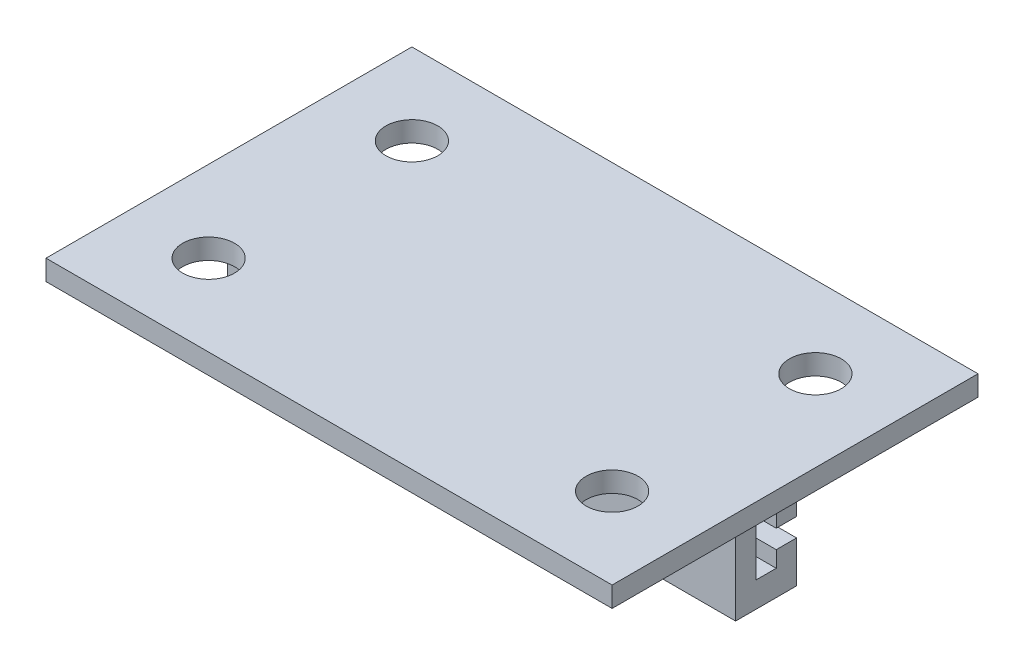
ISO-10303-21;
HEADER;
FILE_DESCRIPTION(('STEP AP214'),'2;1');
FILE_NAME('part.step','',(''),(''),'','','');
FILE_SCHEMA(('AUTOMOTIVE_DESIGN { 1 0 10303 214 1 1 1 1 }'));
ENDSEC;
DATA;
#1=APPLICATION_CONTEXT('core data for automotive mechanical design processes');
#2=APPLICATION_PROTOCOL_DEFINITION('international standard','automotive_design',2000,#1);
#3=PRODUCT_CONTEXT('',#1,'mechanical');
#4=PRODUCT('Part','Part','',(#3));
#5=PRODUCT_RELATED_PRODUCT_CATEGORY('part','',(#4));
#6=PRODUCT_DEFINITION_FORMATION('','',#4);
#7=PRODUCT_DEFINITION_CONTEXT('part definition',#1,'design');
#8=PRODUCT_DEFINITION('design','',#6,#7);
#9=PRODUCT_DEFINITION_SHAPE('','',#8);
#10=(LENGTH_UNIT() NAMED_UNIT(*) SI_UNIT(.MILLI.,.METRE.));
#11=(NAMED_UNIT(*) PLANE_ANGLE_UNIT() SI_UNIT($,.RADIAN.));
#12=(NAMED_UNIT(*) SI_UNIT($,.STERADIAN.) SOLID_ANGLE_UNIT());
#13=UNCERTAINTY_MEASURE_WITH_UNIT(LENGTH_MEASURE(1.E-05),#10,'distance_accuracy_value','');
#14=(GEOMETRIC_REPRESENTATION_CONTEXT(3) GLOBAL_UNCERTAINTY_ASSIGNED_CONTEXT((#13)) GLOBAL_UNIT_ASSIGNED_CONTEXT((#10,
#11,#12)) REPRESENTATION_CONTEXT('',''));
#15=CARTESIAN_POINT('',(0.,0.,0.));
#16=DIRECTION('',(0.,0.,1.));
#17=DIRECTION('',(1.,0.,0.));
#18=AXIS2_PLACEMENT_3D('',#15,#16,#17);
#19=CARTESIAN_POINT('',(50.,0.,-6.));
#20=DIRECTION('',(0.,0.,-1.));
#21=DIRECTION('',(0.,1.,0.));
#22=AXIS2_PLACEMENT_3D('',#19,#20,#21);
#23=PLANE('',#22);
#24=DIRECTION('',(0.,-1.,0.));
#25=VECTOR('',#24,1.);
#26=CARTESIAN_POINT('',(0.,0.,-6.));
#27=LINE('',#26,#25);
#28=CARTESIAN_POINT('',(0.,4.0875,-6.));
#29=VERTEX_POINT('',#28);
#30=CARTESIAN_POINT('',(0.,0.,-6.));
#31=VERTEX_POINT('',#30);
#32=EDGE_CURVE('E190',#29,#31,#27,.T.);
#33=ORIENTED_EDGE('',*,*,#32,.F.);
#34=DIRECTION('',(-1.,0.,0.));
#35=VECTOR('',#34,1.);
#36=CARTESIAN_POINT('',(50.,4.0875,-6.));
#37=LINE('',#36,#35);
#38=CARTESIAN_POINT('',(50.,4.0875,-6.));
#39=VERTEX_POINT('',#38);
#40=EDGE_CURVE('E11',#39,#29,#37,.T.);
#41=ORIENTED_EDGE('',*,*,#40,.F.);
#42=DIRECTION('',(0.,-1.,0.));
#43=VECTOR('',#42,1.);
#44=CARTESIAN_POINT('',(50.,0.,-6.));
#45=LINE('',#44,#43);
#46=CARTESIAN_POINT('',(50.,0.,-6.));
#47=VERTEX_POINT('',#46);
#48=EDGE_CURVE('E214',#39,#47,#45,.T.);
#49=ORIENTED_EDGE('',*,*,#48,.T.);
#50=DIRECTION('',(-1.,0.,0.));
#51=VECTOR('',#50,1.);
#52=CARTESIAN_POINT('',(50.,0.,-6.));
#53=LINE('',#52,#51);
#54=EDGE_CURVE('E99',#47,#31,#53,.T.);
#55=ORIENTED_EDGE('',*,*,#54,.T.);
#56=EDGE_LOOP('',(#33,#41,#49,#55));
#57=FACE_BOUND('',#56,.T.);
#58=ADVANCED_FACE('F39',(#57),#23,.T.);
#59=CARTESIAN_POINT('',(50.,4.0875,0.));
#60=DIRECTION('',(0.,1.,0.));
#61=DIRECTION('',(0.,0.,1.));
#62=AXIS2_PLACEMENT_3D('',#59,#60,#61);
#63=PLANE('',#62);
#64=DIRECTION('',(0.,0.,-1.));
#65=VECTOR('',#64,1.);
#66=CARTESIAN_POINT('',(0.,4.0875,0.));
#67=LINE('',#66,#65);
#68=CARTESIAN_POINT('',(0.,4.0875,-4.));
#69=VERTEX_POINT('',#68);
#70=EDGE_CURVE('E186',#69,#29,#67,.T.);
#71=ORIENTED_EDGE('',*,*,#70,.F.);
#72=DIRECTION('',(-1.,0.,0.));
#73=VECTOR('',#72,1.);
#74=CARTESIAN_POINT('',(50.,4.0875,-4.));
#75=LINE('',#74,#73);
#76=CARTESIAN_POINT('',(50.,4.0875,-4.));
#77=VERTEX_POINT('',#76);
#78=EDGE_CURVE('E47',#77,#69,#75,.T.);
#79=ORIENTED_EDGE('',*,*,#78,.F.);
#80=DIRECTION('',(0.,0.,-1.));
#81=VECTOR('',#80,1.);
#82=CARTESIAN_POINT('',(50.,4.0875,0.));
#83=LINE('',#82,#81);
#84=EDGE_CURVE('E233',#77,#39,#83,.T.);
#85=ORIENTED_EDGE('',*,*,#84,.T.);
#86=ORIENTED_EDGE('',*,*,#40,.T.);
#87=EDGE_LOOP('',(#71,#79,#85,#86));
#88=FACE_BOUND('',#87,.T.);
#89=ADVANCED_FACE('F187',(#88),#63,.T.);
#90=CARTESIAN_POINT('',(50.,0.,-4.));
#91=DIRECTION('',(0.,0.,1.));
#92=DIRECTION('',(1.,0.,0.));
#93=AXIS2_PLACEMENT_3D('',#90,#91,#92);
#94=PLANE('',#93);
#95=DIRECTION('',(0.,1.,0.));
#96=VECTOR('',#95,1.);
#97=CARTESIAN_POINT('',(0.,0.,-4.));
#98=LINE('',#97,#96);
#99=CARTESIAN_POINT('',(0.,2.5,-4.));
#100=VERTEX_POINT('',#99);
#101=EDGE_CURVE('E179',#100,#69,#98,.T.);
#102=ORIENTED_EDGE('',*,*,#101,.F.);
#103=DIRECTION('',(-1.,0.,0.));
#104=VECTOR('',#103,1.);
#105=CARTESIAN_POINT('',(50.,2.5,-4.));
#106=LINE('',#105,#104);
#107=CARTESIAN_POINT('',(50.,2.5,-4.));
#108=VERTEX_POINT('',#107);
#109=EDGE_CURVE('E172',#108,#100,#106,.T.);
#110=ORIENTED_EDGE('',*,*,#109,.F.);
#111=DIRECTION('',(0.,1.,0.));
#112=VECTOR('',#111,1.);
#113=CARTESIAN_POINT('',(50.,0.,-4.));
#114=LINE('',#113,#112);
#115=EDGE_CURVE('E181',#108,#77,#114,.T.);
#116=ORIENTED_EDGE('',*,*,#115,.T.);
#117=ORIENTED_EDGE('',*,*,#78,.T.);
#118=EDGE_LOOP('',(#102,#110,#116,#117));
#119=FACE_BOUND('',#118,.T.);
#120=ADVANCED_FACE('F177',(#119),#94,.T.);
#121=CARTESIAN_POINT('',(50.,2.5,0.));
#122=DIRECTION('',(0.,-1.,0.));
#123=DIRECTION('',(0.,0.,-1.));
#124=AXIS2_PLACEMENT_3D('',#121,#122,#123);
#125=PLANE('',#124);
#126=DIRECTION('',(0.,0.,1.));
#127=VECTOR('',#126,1.);
#128=CARTESIAN_POINT('',(0.,2.5,0.));
#129=LINE('',#128,#127);
#130=CARTESIAN_POINT('',(0.,2.5,-2.));
#131=VERTEX_POINT('',#130);
#132=EDGE_CURVE('E195',#100,#131,#129,.T.);
#133=ORIENTED_EDGE('',*,*,#132,.T.);
#134=DIRECTION('',(-1.,0.,0.));
#135=VECTOR('',#134,1.);
#136=CARTESIAN_POINT('',(50.,2.5,-2.));
#137=LINE('',#136,#135);
#138=CARTESIAN_POINT('',(50.,2.5,-2.));
#139=VERTEX_POINT('',#138);
#140=EDGE_CURVE('E169',#139,#131,#137,.T.);
#141=ORIENTED_EDGE('',*,*,#140,.F.);
#142=DIRECTION('',(0.,0.,1.));
#143=VECTOR('',#142,1.);
#144=CARTESIAN_POINT('',(50.,2.5,0.));
#145=LINE('',#144,#143);
#146=EDGE_CURVE('E236',#108,#139,#145,.T.);
#147=ORIENTED_EDGE('',*,*,#146,.F.);
#148=ORIENTED_EDGE('',*,*,#109,.T.);
#149=EDGE_LOOP('',(#133,#141,#147,#148));
#150=FACE_BOUND('',#149,.T.);
#151=ADVANCED_FACE('F364',(#150),#125,.F.);
#152=CARTESIAN_POINT('',(50.,0.,-2.));
#153=DIRECTION('',(0.,0.,1.));
#154=DIRECTION('',(1.,0.,0.));
#155=AXIS2_PLACEMENT_3D('',#152,#153,#154);
#156=PLANE('',#155);
#157=DIRECTION('',(0.,1.,0.));
#158=VECTOR('',#157,1.);
#159=CARTESIAN_POINT('',(0.,0.,-2.));
#160=LINE('',#159,#158);
#161=CARTESIAN_POINT('',(0.,7.5,-2.));
#162=VERTEX_POINT('',#161);
#163=EDGE_CURVE('E197',#131,#162,#160,.T.);
#164=ORIENTED_EDGE('',*,*,#163,.T.);
#165=DIRECTION('',(-1.,0.,0.));
#166=VECTOR('',#165,1.);
#167=CARTESIAN_POINT('',(50.,7.5,-2.));
#168=LINE('',#167,#166);
#169=CARTESIAN_POINT('',(50.,7.5,-2.));
#170=VERTEX_POINT('',#169);
#171=EDGE_CURVE('E166',#170,#162,#168,.T.);
#172=ORIENTED_EDGE('',*,*,#171,.F.);
#173=DIRECTION('',(0.,1.,0.));
#174=VECTOR('',#173,1.);
#175=CARTESIAN_POINT('',(50.,0.,-2.));
#176=LINE('',#175,#174);
#177=EDGE_CURVE('E238',#139,#170,#176,.T.);
#178=ORIENTED_EDGE('',*,*,#177,.F.);
#179=ORIENTED_EDGE('',*,*,#140,.T.);
#180=EDGE_LOOP('',(#164,#172,#178,#179));
#181=FACE_BOUND('',#180,.T.);
#182=ADVANCED_FACE('F369',(#181),#156,.F.);
#183=CARTESIAN_POINT('',(50.,7.5,0.));
#184=DIRECTION('',(0.,1.,0.));
#185=DIRECTION('',(0.,0.,1.));
#186=AXIS2_PLACEMENT_3D('',#183,#184,#185);
#187=PLANE('',#186);
#188=DIRECTION('',(0.,0.,-1.));
#189=VECTOR('',#188,1.);
#190=CARTESIAN_POINT('',(0.,7.5,0.));
#191=LINE('',#190,#189);
#192=CARTESIAN_POINT('',(0.,7.5,-4.));
#193=VERTEX_POINT('',#192);
#194=EDGE_CURVE('E202',#162,#193,#191,.T.);
#195=ORIENTED_EDGE('',*,*,#194,.T.);
#196=DIRECTION('',(-1.,0.,0.));
#197=VECTOR('',#196,1.);
#198=CARTESIAN_POINT('',(50.,7.5,-4.));
#199=LINE('',#198,#197);
#200=CARTESIAN_POINT('',(50.,7.5,-4.));
#201=VERTEX_POINT('',#200);
#202=EDGE_CURVE('E163',#201,#193,#199,.T.);
#203=ORIENTED_EDGE('',*,*,#202,.F.);
#204=DIRECTION('',(0.,0.,-1.));
#205=VECTOR('',#204,1.);
#206=CARTESIAN_POINT('',(50.,7.5,0.));
#207=LINE('',#206,#205);
#208=EDGE_CURVE('E240',#170,#201,#207,.T.);
#209=ORIENTED_EDGE('',*,*,#208,.F.);
#210=ORIENTED_EDGE('',*,*,#171,.T.);
#211=EDGE_LOOP('',(#195,#203,#209,#210));
#212=FACE_BOUND('',#211,.T.);
#213=ADVANCED_FACE('F373',(#212),#187,.F.);
#214=CARTESIAN_POINT('',(50.,0.,-4.));
#215=DIRECTION('',(0.,0.,-1.));
#216=DIRECTION('',(-1.,0.,0.));
#217=AXIS2_PLACEMENT_3D('',#214,#215,#216);
#218=PLANE('',#217);
#219=DIRECTION('',(0.,-1.,0.));
#220=VECTOR('',#219,1.);
#221=CARTESIAN_POINT('',(0.,0.,-4.));
#222=LINE('',#221,#220);
#223=CARTESIAN_POINT('',(0.,5.9125,-4.));
#224=VERTEX_POINT('',#223);
#225=EDGE_CURVE('E204',#193,#224,#222,.T.);
#226=ORIENTED_EDGE('',*,*,#225,.T.);
#227=DIRECTION('',(-1.,0.,0.));
#228=VECTOR('',#227,1.);
#229=CARTESIAN_POINT('',(50.,5.9125,-4.));
#230=LINE('',#229,#228);
#231=CARTESIAN_POINT('',(50.,5.9125,-4.));
#232=VERTEX_POINT('',#231);
#233=EDGE_CURVE('E160',#232,#224,#230,.T.);
#234=ORIENTED_EDGE('',*,*,#233,.F.);
#235=DIRECTION('',(0.,-1.,0.));
#236=VECTOR('',#235,1.);
#237=CARTESIAN_POINT('',(50.,0.,-4.));
#238=LINE('',#237,#236);
#239=EDGE_CURVE('E242',#201,#232,#238,.T.);
#240=ORIENTED_EDGE('',*,*,#239,.F.);
#241=ORIENTED_EDGE('',*,*,#202,.T.);
#242=EDGE_LOOP('',(#226,#234,#240,#241));
#243=FACE_BOUND('',#242,.T.);
#244=ADVANCED_FACE('F377',(#243),#218,.F.);
#245=CARTESIAN_POINT('',(50.,5.9125,0.));
#246=DIRECTION('',(0.,1.,0.));
#247=DIRECTION('',(0.,0.,1.));
#248=AXIS2_PLACEMENT_3D('',#245,#246,#247);
#249=PLANE('',#248);
#250=DIRECTION('',(0.,0.,-1.));
#251=VECTOR('',#250,1.);
#252=CARTESIAN_POINT('',(0.,5.9125,0.));
#253=LINE('',#252,#251);
#254=CARTESIAN_POINT('',(0.,5.9125,-6.));
#255=VERTEX_POINT('',#254);
#256=EDGE_CURVE('E206',#224,#255,#253,.T.);
#257=ORIENTED_EDGE('',*,*,#256,.T.);
#258=DIRECTION('',(-1.,0.,0.));
#259=VECTOR('',#258,1.);
#260=CARTESIAN_POINT('',(50.,5.9125,-6.));
#261=LINE('',#260,#259);
#262=CARTESIAN_POINT('',(50.,5.9125,-6.));
#263=VERTEX_POINT('',#262);
#264=EDGE_CURVE('E153',#263,#255,#261,.T.);
#265=ORIENTED_EDGE('',*,*,#264,.F.);
#266=DIRECTION('',(0.,0.,-1.));
#267=VECTOR('',#266,1.);
#268=CARTESIAN_POINT('',(50.,5.9125,0.));
#269=LINE('',#268,#267);
#270=EDGE_CURVE('E244',#232,#263,#269,.T.);
#271=ORIENTED_EDGE('',*,*,#270,.F.);
#272=ORIENTED_EDGE('',*,*,#233,.T.);
#273=EDGE_LOOP('',(#257,#265,#271,#272));
#274=FACE_BOUND('',#273,.T.);
#275=ADVANCED_FACE('F251',(#274),#249,.F.);
#276=CARTESIAN_POINT('',(50.,0.,-6.));
#277=DIRECTION('',(0.,0.,1.));
#278=DIRECTION('',(1.,0.,0.));
#279=AXIS2_PLACEMENT_3D('',#276,#277,#278);
#280=PLANE('',#279);
#281=DIRECTION('',(0.,1.,0.));
#282=VECTOR('',#281,1.);
#283=CARTESIAN_POINT('',(0.,0.,-6.));
#284=LINE('',#283,#282);
#285=CARTESIAN_POINT('',(0.,10.,-6.));
#286=VERTEX_POINT('',#285);
#287=EDGE_CURVE('E208',#255,#286,#284,.T.);
#288=ORIENTED_EDGE('',*,*,#287,.T.);
#289=DIRECTION('',(-1.,0.,0.));
#290=VECTOR('',#289,1.);
#291=CARTESIAN_POINT('',(50.,10.,-6.));
#292=LINE('',#291,#290);
#293=CARTESIAN_POINT('',(50.,10.,-6.));
#294=VERTEX_POINT('',#293);
#295=EDGE_CURVE('E151',#294,#286,#292,.T.);
#296=ORIENTED_EDGE('',*,*,#295,.F.);
#297=DIRECTION('',(0.,1.,0.));
#298=VECTOR('',#297,1.);
#299=CARTESIAN_POINT('',(50.,0.,-6.));
#300=LINE('',#299,#298);
#301=EDGE_CURVE('E136',#263,#294,#300,.T.);
#302=ORIENTED_EDGE('',*,*,#301,.F.);
#303=ORIENTED_EDGE('',*,*,#264,.T.);
#304=EDGE_LOOP('',(#288,#296,#302,#303));
#305=FACE_BOUND('',#304,.T.);
#306=ADVANCED_FACE('F255',(#305),#280,.F.);
#307=CARTESIAN_POINT('',(50.,0.,0.));
#308=DIRECTION('',(0.,0.,-1.));
#309=DIRECTION('',(0.,1.,0.));
#310=AXIS2_PLACEMENT_3D('',#307,#308,#309);
#311=PLANE('',#310);
#312=DIRECTION('',(0.,-1.,0.));
#313=VECTOR('',#312,1.);
#314=CARTESIAN_POINT('',(0.,0.,0.));
#315=LINE('',#314,#313);
#316=CARTESIAN_POINT('',(0.,10.,0.));
#317=VERTEX_POINT('',#316);
#318=CARTESIAN_POINT('',(0.,0.,0.));
#319=VERTEX_POINT('',#318);
#320=EDGE_CURVE('E92',#317,#319,#315,.T.);
#321=ORIENTED_EDGE('',*,*,#320,.T.);
#322=DIRECTION('',(-1.,0.,0.));
#323=VECTOR('',#322,1.);
#324=CARTESIAN_POINT('',(50.,0.,0.));
#325=LINE('',#324,#323);
#326=CARTESIAN_POINT('',(50.,0.,0.));
#327=VERTEX_POINT('',#326);
#328=EDGE_CURVE('E144',#327,#319,#325,.T.);
#329=ORIENTED_EDGE('',*,*,#328,.F.);
#330=DIRECTION('',(0.,-1.,0.));
#331=VECTOR('',#330,1.);
#332=CARTESIAN_POINT('',(50.,0.,0.));
#333=LINE('',#332,#331);
#334=CARTESIAN_POINT('',(50.,10.,0.));
#335=VERTEX_POINT('',#334);
#336=EDGE_CURVE('E134',#335,#327,#333,.T.);
#337=ORIENTED_EDGE('',*,*,#336,.F.);
#338=DIRECTION('',(-1.,0.,0.));
#339=VECTOR('',#338,1.);
#340=CARTESIAN_POINT('',(50.,10.,0.));
#341=LINE('',#340,#339);
#342=EDGE_CURVE('E143',#335,#317,#341,.T.);
#343=ORIENTED_EDGE('',*,*,#342,.T.);
#344=EDGE_LOOP('',(#321,#329,#337,#343));
#345=FACE_BOUND('',#344,.T.);
#346=ADVANCED_FACE('F142',(#345),#311,.F.);
#347=CARTESIAN_POINT('',(50.,0.,0.));
#348=DIRECTION('',(0.,1.,0.));
#349=DIRECTION('',(0.,0.,1.));
#350=AXIS2_PLACEMENT_3D('',#347,#348,#349);
#351=PLANE('',#350);
#352=DIRECTION('',(0.,0.,-1.));
#353=VECTOR('',#352,1.);
#354=CARTESIAN_POINT('',(0.,0.,0.));
#355=LINE('',#354,#353);
#356=EDGE_CURVE('E213',#319,#31,#355,.T.);
#357=ORIENTED_EDGE('',*,*,#356,.T.);
#358=ORIENTED_EDGE('',*,*,#54,.F.);
#359=DIRECTION('',(0.,0.,-1.));
#360=VECTOR('',#359,1.);
#361=CARTESIAN_POINT('',(50.,0.,0.));
#362=LINE('',#361,#360);
#363=EDGE_CURVE('E55',#327,#47,#362,.T.);
#364=ORIENTED_EDGE('',*,*,#363,.F.);
#365=ORIENTED_EDGE('',*,*,#328,.T.);
#366=EDGE_LOOP('',(#357,#358,#364,#365));
#367=FACE_BOUND('',#366,.T.);
#368=ADVANCED_FACE('F388',(#367),#351,.F.);
#369=CARTESIAN_POINT('',(50.,0.,0.));
#370=DIRECTION('',(1.,0.,0.));
#371=DIRECTION('',(0.,0.,-1.));
#372=AXIS2_PLACEMENT_3D('',#369,#370,#371);
#373=PLANE('',#372);
#374=ORIENTED_EDGE('',*,*,#48,.F.);
#375=ORIENTED_EDGE('',*,*,#84,.F.);
#376=ORIENTED_EDGE('',*,*,#115,.F.);
#377=ORIENTED_EDGE('',*,*,#146,.T.);
#378=ORIENTED_EDGE('',*,*,#177,.T.);
#379=ORIENTED_EDGE('',*,*,#208,.T.);
#380=ORIENTED_EDGE('',*,*,#239,.T.);
#381=ORIENTED_EDGE('',*,*,#270,.T.);
#382=ORIENTED_EDGE('',*,*,#301,.T.);
#383=DIRECTION('',(0.,0.,1.));
#384=VECTOR('',#383,1.);
#385=CARTESIAN_POINT('',(50.,10.,0.));
#386=LINE('',#385,#384);
#387=EDGE_CURVE('E131',#294,#335,#386,.T.);
#388=ORIENTED_EDGE('',*,*,#387,.T.);
#389=ORIENTED_EDGE('',*,*,#336,.T.);
#390=ORIENTED_EDGE('',*,*,#363,.T.);
#391=EDGE_LOOP('',(#374,#375,#376,#377,#378,#379,#380,#381,#382,#388,#389,#390));
#392=FACE_BOUND('',#391,.T.);
#393=ADVANCED_FACE('F133',(#392),#373,.T.);
#394=CARTESIAN_POINT('',(0.,0.,0.));
#395=DIRECTION('',(1.,0.,0.));
#396=DIRECTION('',(0.,0.,-1.));
#397=AXIS2_PLACEMENT_3D('',#394,#395,#396);
#398=PLANE('',#397);
#399=ORIENTED_EDGE('',*,*,#32,.T.);
#400=ORIENTED_EDGE('',*,*,#356,.F.);
#401=ORIENTED_EDGE('',*,*,#320,.F.);
#402=DIRECTION('',(0.,0.,1.));
#403=VECTOR('',#402,1.);
#404=CARTESIAN_POINT('',(0.,10.,0.));
#405=LINE('',#404,#403);
#406=EDGE_CURVE('E150',#286,#317,#405,.T.);
#407=ORIENTED_EDGE('',*,*,#406,.F.);
#408=ORIENTED_EDGE('',*,*,#287,.F.);
#409=ORIENTED_EDGE('',*,*,#256,.F.);
#410=ORIENTED_EDGE('',*,*,#225,.F.);
#411=ORIENTED_EDGE('',*,*,#194,.F.);
#412=ORIENTED_EDGE('',*,*,#163,.F.);
#413=ORIENTED_EDGE('',*,*,#132,.F.);
#414=ORIENTED_EDGE('',*,*,#101,.T.);
#415=ORIENTED_EDGE('',*,*,#70,.T.);
#416=EDGE_LOOP('',(#399,#400,#401,#407,#408,#409,#410,#411,#412,#413,#414,#415));
#417=FACE_BOUND('',#416,.T.);
#418=ADVANCED_FACE('F193',(#417),#398,.F.);
#419=CARTESIAN_POINT('',(0.,12.,0.));
#420=DIRECTION('',(0.,-1.,0.));
#421=DIRECTION('',(0.,0.,-1.));
#422=AXIS2_PLACEMENT_3D('',#419,#420,#421);
#423=PLANE('',#422);
#424=DIRECTION('',(0.,0.,1.));
#425=VECTOR('',#424,1.);
#426=CARTESIAN_POINT('',(-2.85,12.,15.));
#427=LINE('',#426,#425);
#428=CARTESIAN_POINT('',(-2.85000000000001,12.,-21.));
#429=VERTEX_POINT('',#428);
#430=CARTESIAN_POINT('',(-2.85,12.,15.));
#431=VERTEX_POINT('',#430);
#432=EDGE_CURVE('E294',#429,#431,#427,.T.);
#433=ORIENTED_EDGE('',*,*,#432,.T.);
#434=DIRECTION('',(1.,0.,0.));
#435=VECTOR('',#434,1.);
#436=CARTESIAN_POINT('',(-2.85,12.,15.));
#437=LINE('',#436,#435);
#438=CARTESIAN_POINT('',(52.85,12.,15.));
#439=VERTEX_POINT('',#438);
#440=EDGE_CURVE('E287',#431,#439,#437,.T.);
#441=ORIENTED_EDGE('',*,*,#440,.T.);
#442=DIRECTION('',(0.,0.,-1.));
#443=VECTOR('',#442,1.);
#444=CARTESIAN_POINT('',(52.85,12.,15.));
#445=LINE('',#444,#443);
#446=CARTESIAN_POINT('',(52.85,12.,-21.));
#447=VERTEX_POINT('',#446);
#448=EDGE_CURVE('E291',#439,#447,#445,.T.);
#449=ORIENTED_EDGE('',*,*,#448,.T.);
#450=DIRECTION('',(-1.,0.,0.));
#451=VECTOR('',#450,1.);
#452=CARTESIAN_POINT('',(-2.85000000000001,12.,-21.));
#453=LINE('',#452,#451);
#454=EDGE_CURVE('E264',#447,#429,#453,.T.);
#455=ORIENTED_EDGE('',*,*,#454,.T.);
#456=EDGE_LOOP('',(#433,#441,#449,#455));
#457=FACE_BOUND('',#456,.T.);
#458=CARTESIAN_POINT('',(5.15,12.,-13.));
#459=DIRECTION('',(0.,1.,0.));
#460=DIRECTION('',(0.,0.,1.));
#461=AXIS2_PLACEMENT_3D('',#458,#459,#460);
#462=CIRCLE('',#461,2.55);
#463=CARTESIAN_POINT('',(5.15,12.,-10.45));
#464=VERTEX_POINT('',#463);
#465=EDGE_CURVE('E308',#464,#464,#462,.T.);
#466=ORIENTED_EDGE('',*,*,#465,.F.);
#467=EDGE_LOOP('',(#466));
#468=FACE_BOUND('',#467,.T.);
#469=CARTESIAN_POINT('',(44.85,12.,-13.));
#470=DIRECTION('',(0.,1.,0.));
#471=DIRECTION('',(0.,0.,1.));
#472=AXIS2_PLACEMENT_3D('',#469,#470,#471);
#473=CIRCLE('',#472,2.55);
#474=CARTESIAN_POINT('',(44.85,12.,-10.45));
#475=VERTEX_POINT('',#474);
#476=EDGE_CURVE('E323',#475,#475,#473,.T.);
#477=ORIENTED_EDGE('',*,*,#476,.F.);
#478=EDGE_LOOP('',(#477));
#479=FACE_BOUND('',#478,.T.);
#480=CARTESIAN_POINT('',(44.85,12.,7.));
#481=DIRECTION('',(0.,1.,0.));
#482=DIRECTION('',(0.,0.,1.));
#483=AXIS2_PLACEMENT_3D('',#480,#481,#482);
#484=CIRCLE('',#483,2.55);
#485=CARTESIAN_POINT('',(44.85,12.,9.55));
#486=VERTEX_POINT('',#485);
#487=EDGE_CURVE('E329',#486,#486,#484,.T.);
#488=ORIENTED_EDGE('',*,*,#487,.F.);
#489=EDGE_LOOP('',(#488));
#490=FACE_BOUND('',#489,.T.);
#491=CARTESIAN_POINT('',(5.15,12.,7.));
#492=DIRECTION('',(0.,1.,0.));
#493=DIRECTION('',(0.,0.,1.));
#494=AXIS2_PLACEMENT_3D('',#491,#492,#493);
#495=CIRCLE('',#494,2.55);
#496=CARTESIAN_POINT('',(5.15,12.,9.55));
#497=VERTEX_POINT('',#496);
#498=EDGE_CURVE('E335',#497,#497,#495,.T.);
#499=ORIENTED_EDGE('',*,*,#498,.F.);
#500=EDGE_LOOP('',(#499));
#501=FACE_BOUND('',#500,.T.);
#502=ADVANCED_FACE('F288',(#457,#468,#479,#490,#501),#423,.F.);
#503=CARTESIAN_POINT('',(0.,10.,0.));
#504=DIRECTION('',(0.,-1.,0.));
#505=DIRECTION('',(0.,0.,-1.));
#506=AXIS2_PLACEMENT_3D('',#503,#504,#505);
#507=PLANE('',#506);
#508=ORIENTED_EDGE('',*,*,#295,.T.);
#509=ORIENTED_EDGE('',*,*,#406,.T.);
#510=ORIENTED_EDGE('',*,*,#342,.F.);
#511=ORIENTED_EDGE('',*,*,#387,.F.);
#512=EDGE_LOOP('',(#508,#509,#510,#511));
#513=FACE_BOUND('',#512,.T.);
#514=CARTESIAN_POINT('',(44.85,10.,7.));
#515=DIRECTION('',(0.,1.,0.));
#516=DIRECTION('',(0.,0.,1.));
#517=AXIS2_PLACEMENT_3D('',#514,#515,#516);
#518=CIRCLE('',#517,2.55);
#519=CARTESIAN_POINT('',(44.85,10.,9.55));
#520=VERTEX_POINT('',#519);
#521=EDGE_CURVE('E332',#520,#520,#518,.T.);
#522=ORIENTED_EDGE('',*,*,#521,.T.);
#523=EDGE_LOOP('',(#522));
#524=FACE_BOUND('',#523,.T.);
#525=CARTESIAN_POINT('',(5.15,10.,-13.));
#526=DIRECTION('',(0.,1.,0.));
#527=DIRECTION('',(0.,0.,1.));
#528=AXIS2_PLACEMENT_3D('',#525,#526,#527);
#529=CIRCLE('',#528,2.55);
#530=CARTESIAN_POINT('',(5.15,10.,-10.45));
#531=VERTEX_POINT('',#530);
#532=EDGE_CURVE('E320',#531,#531,#529,.T.);
#533=ORIENTED_EDGE('',*,*,#532,.T.);
#534=EDGE_LOOP('',(#533));
#535=FACE_BOUND('',#534,.T.);
#536=DIRECTION('',(0.,0.,1.));
#537=VECTOR('',#536,1.);
#538=CARTESIAN_POINT('',(-2.85,10.,15.));
#539=LINE('',#538,#537);
#540=CARTESIAN_POINT('',(-2.85000000000001,10.,-21.));
#541=VERTEX_POINT('',#540);
#542=CARTESIAN_POINT('',(-2.85,10.,15.));
#543=VERTEX_POINT('',#542);
#544=EDGE_CURVE('E306',#541,#543,#539,.T.);
#545=ORIENTED_EDGE('',*,*,#544,.F.);
#546=DIRECTION('',(-1.,0.,0.));
#547=VECTOR('',#546,1.);
#548=CARTESIAN_POINT('',(-2.85000000000001,10.,-21.));
#549=LINE('',#548,#547);
#550=CARTESIAN_POINT('',(52.85,10.,-21.));
#551=VERTEX_POINT('',#550);
#552=EDGE_CURVE('E282',#551,#541,#549,.T.);
#553=ORIENTED_EDGE('',*,*,#552,.F.);
#554=DIRECTION('',(0.,0.,-1.));
#555=VECTOR('',#554,1.);
#556=CARTESIAN_POINT('',(52.85,10.,15.));
#557=LINE('',#556,#555);
#558=CARTESIAN_POINT('',(52.85,10.,15.));
#559=VERTEX_POINT('',#558);
#560=EDGE_CURVE('E310',#559,#551,#557,.T.);
#561=ORIENTED_EDGE('',*,*,#560,.F.);
#562=DIRECTION('',(1.,0.,0.));
#563=VECTOR('',#562,1.);
#564=CARTESIAN_POINT('',(-2.85,10.,15.));
#565=LINE('',#564,#563);
#566=EDGE_CURVE('E297',#543,#559,#565,.T.);
#567=ORIENTED_EDGE('',*,*,#566,.F.);
#568=EDGE_LOOP('',(#545,#553,#561,#567));
#569=FACE_BOUND('',#568,.T.);
#570=CARTESIAN_POINT('',(44.85,10.,-13.));
#571=DIRECTION('',(0.,1.,0.));
#572=DIRECTION('',(0.,0.,1.));
#573=AXIS2_PLACEMENT_3D('',#570,#571,#572);
#574=CIRCLE('',#573,2.55);
#575=CARTESIAN_POINT('',(44.85,10.,-10.45));
#576=VERTEX_POINT('',#575);
#577=EDGE_CURVE('E326',#576,#576,#574,.T.);
#578=ORIENTED_EDGE('',*,*,#577,.T.);
#579=EDGE_LOOP('',(#578));
#580=FACE_BOUND('',#579,.T.);
#581=CARTESIAN_POINT('',(5.15,10.,7.));
#582=DIRECTION('',(0.,1.,0.));
#583=DIRECTION('',(0.,0.,1.));
#584=AXIS2_PLACEMENT_3D('',#581,#582,#583);
#585=CIRCLE('',#584,2.55);
#586=CARTESIAN_POINT('',(5.15,10.,9.55));
#587=VERTEX_POINT('',#586);
#588=EDGE_CURVE('E338',#587,#587,#585,.T.);
#589=ORIENTED_EDGE('',*,*,#588,.T.);
#590=EDGE_LOOP('',(#589));
#591=FACE_BOUND('',#590,.T.);
#592=ADVANCED_FACE('F147',(#513,#524,#535,#569,#580,#591),#507,.T.);
#593=CARTESIAN_POINT('',(-2.85,12.,15.));
#594=DIRECTION('',(1.,0.,0.));
#595=DIRECTION('',(0.,0.,-1.));
#596=AXIS2_PLACEMENT_3D('',#593,#594,#595);
#597=PLANE('',#596);
#598=ORIENTED_EDGE('',*,*,#544,.T.);
#599=DIRECTION('',(0.,-1.,0.));
#600=VECTOR('',#599,1.);
#601=CARTESIAN_POINT('',(-2.85,12.,15.));
#602=LINE('',#601,#600);
#603=EDGE_CURVE('E216',#431,#543,#602,.T.);
#604=ORIENTED_EDGE('',*,*,#603,.F.);
#605=ORIENTED_EDGE('',*,*,#432,.F.);
#606=DIRECTION('',(0.,-1.,0.));
#607=VECTOR('',#606,1.);
#608=CARTESIAN_POINT('',(-2.85000000000001,12.,-21.));
#609=LINE('',#608,#607);
#610=EDGE_CURVE('E302',#429,#541,#609,.T.);
#611=ORIENTED_EDGE('',*,*,#610,.T.);
#612=EDGE_LOOP('',(#598,#604,#605,#611));
#613=FACE_BOUND('',#612,.T.);
#614=ADVANCED_FACE('F318',(#613),#597,.F.);
#615=CARTESIAN_POINT('',(-2.85,12.,15.));
#616=DIRECTION('',(0.,0.,-1.));
#617=DIRECTION('',(-1.,0.,0.));
#618=AXIS2_PLACEMENT_3D('',#615,#616,#617);
#619=PLANE('',#618);
#620=ORIENTED_EDGE('',*,*,#566,.T.);
#621=DIRECTION('',(0.,-1.,0.));
#622=VECTOR('',#621,1.);
#623=CARTESIAN_POINT('',(52.85,12.,15.));
#624=LINE('',#623,#622);
#625=EDGE_CURVE('E219',#439,#559,#624,.T.);
#626=ORIENTED_EDGE('',*,*,#625,.F.);
#627=ORIENTED_EDGE('',*,*,#440,.F.);
#628=ORIENTED_EDGE('',*,*,#603,.T.);
#629=EDGE_LOOP('',(#620,#626,#627,#628));
#630=FACE_BOUND('',#629,.T.);
#631=ADVANCED_FACE('F296',(#630),#619,.F.);
#632=CARTESIAN_POINT('',(52.85,12.,15.));
#633=DIRECTION('',(-1.,0.,0.));
#634=DIRECTION('',(0.,0.,1.));
#635=AXIS2_PLACEMENT_3D('',#632,#633,#634);
#636=PLANE('',#635);
#637=ORIENTED_EDGE('',*,*,#560,.T.);
#638=DIRECTION('',(0.,-1.,0.));
#639=VECTOR('',#638,1.);
#640=CARTESIAN_POINT('',(52.85,12.,-21.));
#641=LINE('',#640,#639);
#642=EDGE_CURVE('E228',#447,#551,#641,.T.);
#643=ORIENTED_EDGE('',*,*,#642,.F.);
#644=ORIENTED_EDGE('',*,*,#448,.F.);
#645=ORIENTED_EDGE('',*,*,#625,.T.);
#646=EDGE_LOOP('',(#637,#643,#644,#645));
#647=FACE_BOUND('',#646,.T.);
#648=ADVANCED_FACE('F300',(#647),#636,.F.);
#649=CARTESIAN_POINT('',(-2.85000000000001,12.,-21.));
#650=DIRECTION('',(0.,0.,1.));
#651=DIRECTION('',(1.,0.,0.));
#652=AXIS2_PLACEMENT_3D('',#649,#650,#651);
#653=PLANE('',#652);
#654=ORIENTED_EDGE('',*,*,#552,.T.);
#655=ORIENTED_EDGE('',*,*,#610,.F.);
#656=ORIENTED_EDGE('',*,*,#454,.F.);
#657=ORIENTED_EDGE('',*,*,#642,.T.);
#658=EDGE_LOOP('',(#654,#655,#656,#657));
#659=FACE_BOUND('',#658,.T.);
#660=ADVANCED_FACE('F313',(#659),#653,.F.);
#661=CARTESIAN_POINT('',(5.15,12.,-13.));
#662=DIRECTION('',(0.,-1.,0.));
#663=DIRECTION('',(0.,0.,-1.));
#664=AXIS2_PLACEMENT_3D('',#661,#662,#663);
#665=CYLINDRICAL_SURFACE('',#664,2.55);
#666=ORIENTED_EDGE('',*,*,#465,.T.);
#667=EDGE_LOOP('',(#666));
#668=FACE_BOUND('',#667,.T.);
#669=ORIENTED_EDGE('',*,*,#532,.F.);
#670=EDGE_LOOP('',(#669));
#671=FACE_BOUND('',#670,.T.);
#672=ADVANCED_FACE('F401',(#668,#671),#665,.F.);
#673=CARTESIAN_POINT('',(44.85,12.,-13.));
#674=DIRECTION('',(0.,-1.,0.));
#675=DIRECTION('',(0.,0.,-1.));
#676=AXIS2_PLACEMENT_3D('',#673,#674,#675);
#677=CYLINDRICAL_SURFACE('',#676,2.55);
#678=ORIENTED_EDGE('',*,*,#476,.T.);
#679=EDGE_LOOP('',(#678));
#680=FACE_BOUND('',#679,.T.);
#681=ORIENTED_EDGE('',*,*,#577,.F.);
#682=EDGE_LOOP('',(#681));
#683=FACE_BOUND('',#682,.T.);
#684=ADVANCED_FACE('F405',(#680,#683),#677,.F.);
#685=CARTESIAN_POINT('',(44.85,12.,7.));
#686=DIRECTION('',(0.,-1.,0.));
#687=DIRECTION('',(0.,0.,-1.));
#688=AXIS2_PLACEMENT_3D('',#685,#686,#687);
#689=CYLINDRICAL_SURFACE('',#688,2.55);
#690=ORIENTED_EDGE('',*,*,#487,.T.);
#691=EDGE_LOOP('',(#690));
#692=FACE_BOUND('',#691,.T.);
#693=ORIENTED_EDGE('',*,*,#521,.F.);
#694=EDGE_LOOP('',(#693));
#695=FACE_BOUND('',#694,.T.);
#696=ADVANCED_FACE('F410',(#692,#695),#689,.F.);
#697=CARTESIAN_POINT('',(5.15,12.,7.));
#698=DIRECTION('',(0.,-1.,0.));
#699=DIRECTION('',(0.,0.,-1.));
#700=AXIS2_PLACEMENT_3D('',#697,#698,#699);
#701=CYLINDRICAL_SURFACE('',#700,2.55);
#702=ORIENTED_EDGE('',*,*,#498,.T.);
#703=EDGE_LOOP('',(#702));
#704=FACE_BOUND('',#703,.T.);
#705=ORIENTED_EDGE('',*,*,#588,.F.);
#706=EDGE_LOOP('',(#705));
#707=FACE_BOUND('',#706,.T.);
#708=ADVANCED_FACE('F344',(#704,#707),#701,.F.);
#709=CLOSED_SHELL('',(#58,#89,#120,#151,#182,#213,#244,#275,#306,#346,#368,#393,#418,#502,#592,
#614,#631,#648,#660,#672,#684,#696,#708));
#710=MANIFOLD_SOLID_BREP('B2',#709);
#711=ADVANCED_BREP_SHAPE_REPRESENTATION('',(#18,#710),#14);
#712=SHAPE_DEFINITION_REPRESENTATION(#9,#711);
ENDSEC;
END-ISO-10303-21;
